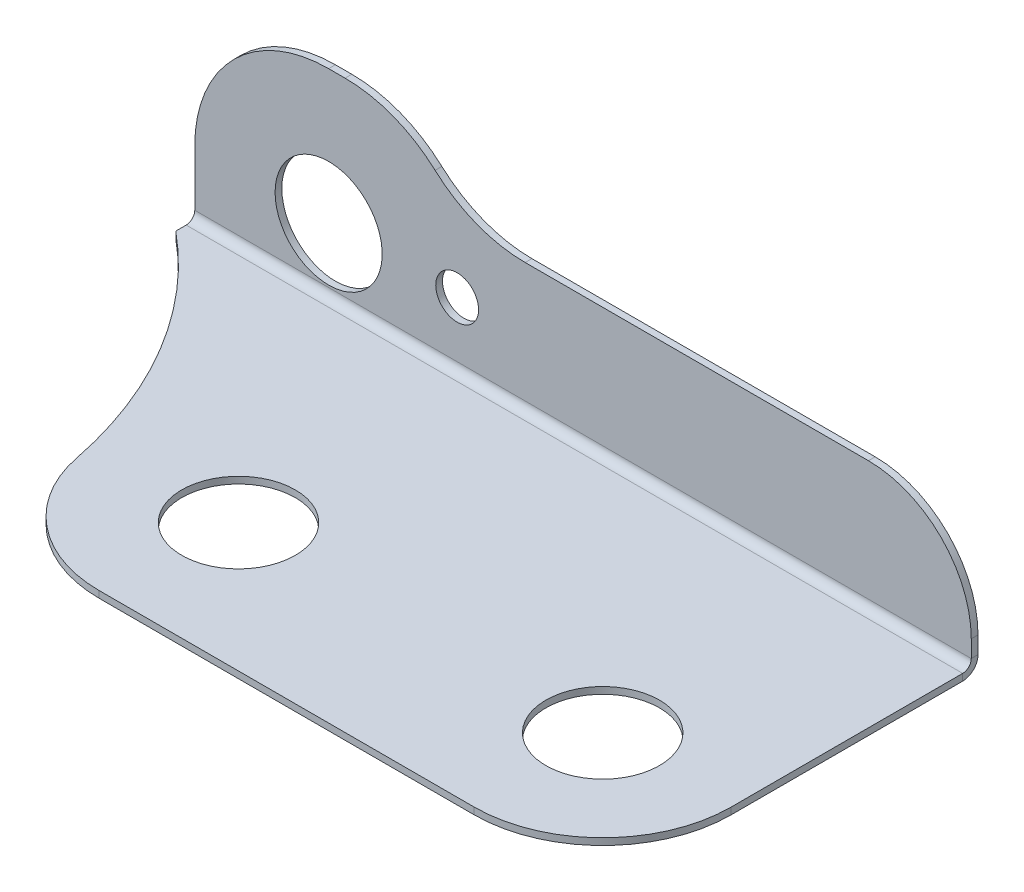
ISO-10303-21;
HEADER;
FILE_DESCRIPTION(('STEP AP214'),'2;1');
FILE_NAME('part.step','',(''),(''),'','','');
FILE_SCHEMA(('AUTOMOTIVE_DESIGN { 1 0 10303 214 1 1 1 1 }'));
ENDSEC;
DATA;
#1=APPLICATION_CONTEXT('core data for automotive mechanical design processes');
#2=APPLICATION_PROTOCOL_DEFINITION('international standard','automotive_design',2000,#1);
#3=PRODUCT_CONTEXT('',#1,'mechanical');
#4=PRODUCT('Part','Part','',(#3));
#5=PRODUCT_RELATED_PRODUCT_CATEGORY('part','',(#4));
#6=PRODUCT_DEFINITION_FORMATION('','',#4);
#7=PRODUCT_DEFINITION_CONTEXT('part definition',#1,'design');
#8=PRODUCT_DEFINITION('design','',#6,#7);
#9=PRODUCT_DEFINITION_SHAPE('','',#8);
#10=(LENGTH_UNIT() NAMED_UNIT(*) SI_UNIT(.MILLI.,.METRE.));
#11=(NAMED_UNIT(*) PLANE_ANGLE_UNIT() SI_UNIT($,.RADIAN.));
#12=(NAMED_UNIT(*) SI_UNIT($,.STERADIAN.) SOLID_ANGLE_UNIT());
#13=UNCERTAINTY_MEASURE_WITH_UNIT(LENGTH_MEASURE(1.E-05),#10,'distance_accuracy_value','');
#14=(GEOMETRIC_REPRESENTATION_CONTEXT(3) GLOBAL_UNCERTAINTY_ASSIGNED_CONTEXT((#13)) GLOBAL_UNIT_ASSIGNED_CONTEXT((#10,
#11,#12)) REPRESENTATION_CONTEXT('',''));
#15=CARTESIAN_POINT('',(0.,0.,0.));
#16=DIRECTION('',(0.,0.,1.));
#17=DIRECTION('',(1.,0.,0.));
#18=AXIS2_PLACEMENT_3D('',#15,#16,#17);
#19=CARTESIAN_POINT('',(-27.6225,-0.39878,-14.6328892));
#20=DIRECTION('',(-1.,0.,0.));
#21=DIRECTION('',(0.,1.,0.));
#22=AXIS2_PLACEMENT_3D('',#19,#20,#21);
#23=PLANE('',#22);
#24=DIRECTION('',(0.,0.,-1.));
#25=VECTOR('',#24,1.);
#26=CARTESIAN_POINT('',(-27.6225,0.50922,-14.6328892));
#27=LINE('',#26,#25);
#28=CARTESIAN_POINT('',(-27.6225,0.50922,-14.2328892));
#29=VERTEX_POINT('',#28);
#30=CARTESIAN_POINT('',(-27.6225,0.50922,-14.6328892));
#31=VERTEX_POINT('',#30);
#32=EDGE_CURVE('E11',#29,#31,#27,.T.);
#33=ORIENTED_EDGE('',*,*,#32,.F.);
#34=DIRECTION('',(0.,1.,0.));
#35=VECTOR('',#34,1.);
#36=CARTESIAN_POINT('',(-27.6225,-0.39878,-14.2328892));
#37=LINE('',#36,#35);
#38=CARTESIAN_POINT('',(-27.6225,3.81,-14.2328892));
#39=VERTEX_POINT('',#38);
#40=EDGE_CURVE('E111',#29,#39,#37,.T.);
#41=ORIENTED_EDGE('',*,*,#40,.T.);
#42=DIRECTION('',(0.,0.,-1.));
#43=VECTOR('',#42,1.);
#44=CARTESIAN_POINT('',(-27.6225,3.81,-14.6328892));
#45=LINE('',#44,#43);
#46=CARTESIAN_POINT('',(-27.6225,3.81,-14.6328892));
#47=VERTEX_POINT('',#46);
#48=EDGE_CURVE('E48',#39,#47,#45,.T.);
#49=ORIENTED_EDGE('',*,*,#48,.T.);
#50=DIRECTION('',(0.,1.,0.));
#51=VECTOR('',#50,1.);
#52=CARTESIAN_POINT('',(-27.6225,-0.39878,-14.6328892));
#53=LINE('',#52,#51);
#54=EDGE_CURVE('E113',#31,#47,#53,.T.);
#55=ORIENTED_EDGE('',*,*,#54,.F.);
#56=EDGE_LOOP('',(#33,#41,#49,#55));
#57=FACE_BOUND('',#56,.T.);
#58=ADVANCED_FACE('F38',(#57),#23,.T.);
#59=CARTESIAN_POINT('',(-19.685,3.81,-14.6328892));
#60=DIRECTION('',(0.,0.,-1.));
#61=DIRECTION('',(-1.,0.,0.));
#62=AXIS2_PLACEMENT_3D('',#59,#60,#61);
#63=CYLINDRICAL_SURFACE('',#62,7.9375);
#64=ORIENTED_EDGE('',*,*,#48,.F.);
#65=CARTESIAN_POINT('',(-19.685,3.81,-14.2328892));
#66=DIRECTION('',(0.,0.,-1.));
#67=DIRECTION('',(-1.,0.,0.));
#68=AXIS2_PLACEMENT_3D('',#65,#66,#67);
#69=CIRCLE('',#68,7.9375);
#70=CARTESIAN_POINT('',(-19.685,11.7475,-14.2328892));
#71=VERTEX_POINT('',#70);
#72=EDGE_CURVE('E138',#39,#71,#69,.T.);
#73=ORIENTED_EDGE('',*,*,#72,.T.);
#74=DIRECTION('',(0.,0.,-1.));
#75=VECTOR('',#74,1.);
#76=CARTESIAN_POINT('',(-19.685,11.7475,-14.6328892));
#77=LINE('',#76,#75);
#78=CARTESIAN_POINT('',(-19.685,11.7475,-14.6328892));
#79=VERTEX_POINT('',#78);
#80=EDGE_CURVE('E189',#71,#79,#77,.T.);
#81=ORIENTED_EDGE('',*,*,#80,.T.);
#82=CARTESIAN_POINT('',(-19.685,3.81,-14.6328892));
#83=DIRECTION('',(0.,0.,-1.));
#84=DIRECTION('',(-1.,0.,0.));
#85=AXIS2_PLACEMENT_3D('',#82,#83,#84);
#86=CIRCLE('',#85,7.9375);
#87=EDGE_CURVE('E203',#47,#79,#86,.T.);
#88=ORIENTED_EDGE('',*,*,#87,.F.);
#89=EDGE_LOOP('',(#64,#73,#81,#88));
#90=FACE_BOUND('',#89,.T.);
#91=ADVANCED_FACE('F209',(#90),#63,.T.);
#92=CARTESIAN_POINT('',(-27.6225,11.7475,-14.6328892));
#93=DIRECTION('',(0.,-1.,0.));
#94=DIRECTION('',(-1.,0.,0.));
#95=AXIS2_PLACEMENT_3D('',#92,#93,#94);
#96=PLANE('',#95);
#97=ORIENTED_EDGE('',*,*,#80,.F.);
#98=DIRECTION('',(-1.,0.,0.));
#99=VECTOR('',#98,1.);
#100=CARTESIAN_POINT('',(18.415,11.7475,-14.2328892));
#101=LINE('',#100,#99);
#102=CARTESIAN_POINT('',(-18.710818623329,11.7475,-14.2328892));
#103=VERTEX_POINT('',#102);
#104=EDGE_CURVE('E153',#103,#71,#101,.T.);
#105=ORIENTED_EDGE('',*,*,#104,.F.);
#106=DIRECTION('',(0.,0.,-1.));
#107=VECTOR('',#106,1.);
#108=CARTESIAN_POINT('',(-18.710818623329,11.7475,-14.6328892));
#109=LINE('',#108,#107);
#110=CARTESIAN_POINT('',(-18.710818623329,11.7475,-14.6328892));
#111=VERTEX_POINT('',#110);
#112=EDGE_CURVE('E186',#103,#111,#109,.T.);
#113=ORIENTED_EDGE('',*,*,#112,.T.);
#114=DIRECTION('',(-1.,0.,0.));
#115=VECTOR('',#114,1.);
#116=CARTESIAN_POINT('',(-27.6225,11.7475,-14.6328892));
#117=LINE('',#116,#115);
#118=EDGE_CURVE('E289',#111,#79,#117,.T.);
#119=ORIENTED_EDGE('',*,*,#118,.T.);
#120=EDGE_LOOP('',(#97,#105,#113,#119));
#121=FACE_BOUND('',#120,.T.);
#122=ADVANCED_FACE('F287',(#121),#96,.F.);
#123=CARTESIAN_POINT('',(-18.710818623329,3.81,-14.6328892));
#124=DIRECTION('',(0.,0.,-1.));
#125=DIRECTION('',(-1.,0.,0.));
#126=AXIS2_PLACEMENT_3D('',#123,#124,#125);
#127=CYLINDRICAL_SURFACE('',#126,7.9375);
#128=ORIENTED_EDGE('',*,*,#112,.F.);
#129=CARTESIAN_POINT('',(-18.710818623329,3.81,-14.2328892));
#130=DIRECTION('',(0.,0.,-1.));
#131=DIRECTION('',(-1.,0.,0.));
#132=AXIS2_PLACEMENT_3D('',#129,#130,#131);
#133=CIRCLE('',#132,7.9375);
#134=CARTESIAN_POINT('',(-13.3720016019749,9.68375,-14.2328892));
#135=VERTEX_POINT('',#134);
#136=EDGE_CURVE('E280',#103,#135,#133,.T.);
#137=ORIENTED_EDGE('',*,*,#136,.T.);
#138=DIRECTION('',(0.,0.,-1.));
#139=VECTOR('',#138,1.);
#140=CARTESIAN_POINT('',(-13.3720016019749,9.68375,-14.6328892));
#141=LINE('',#140,#139);
#142=CARTESIAN_POINT('',(-13.3720016019749,9.68375,-14.6328892));
#143=VERTEX_POINT('',#142);
#144=EDGE_CURVE('E183',#135,#143,#141,.T.);
#145=ORIENTED_EDGE('',*,*,#144,.T.);
#146=CARTESIAN_POINT('',(-18.710818623329,3.81,-14.6328892));
#147=DIRECTION('',(0.,0.,-1.));
#148=DIRECTION('',(-1.,0.,0.));
#149=AXIS2_PLACEMENT_3D('',#146,#147,#148);
#150=CIRCLE('',#149,7.9375);
#151=EDGE_CURVE('E294',#111,#143,#150,.T.);
#152=ORIENTED_EDGE('',*,*,#151,.F.);
#153=EDGE_LOOP('',(#128,#137,#145,#152));
#154=FACE_BOUND('',#153,.T.);
#155=ADVANCED_FACE('F348',(#154),#127,.T.);
#156=CARTESIAN_POINT('',(-8.03318458062082,15.5575,-14.6328892));
#157=DIRECTION('',(0.,0.,-1.));
#158=DIRECTION('',(-1.,0.,0.));
#159=AXIS2_PLACEMENT_3D('',#156,#157,#158);
#160=CYLINDRICAL_SURFACE('',#159,7.9375);
#161=ORIENTED_EDGE('',*,*,#144,.F.);
#162=CARTESIAN_POINT('',(-8.03318458062082,15.5575,-14.2328892));
#163=DIRECTION('',(0.,0.,-1.));
#164=DIRECTION('',(-1.,0.,0.));
#165=AXIS2_PLACEMENT_3D('',#162,#163,#164);
#166=CIRCLE('',#165,7.9375);
#167=CARTESIAN_POINT('',(-8.03318458062081,7.62,-14.2328892));
#168=VERTEX_POINT('',#167);
#169=EDGE_CURVE('E277',#135,#168,#166,.F.);
#170=ORIENTED_EDGE('',*,*,#169,.T.);
#171=DIRECTION('',(0.,0.,-1.));
#172=VECTOR('',#171,1.);
#173=CARTESIAN_POINT('',(-8.03318458062081,7.62,-14.6328892));
#174=LINE('',#173,#172);
#175=CARTESIAN_POINT('',(-8.03318458062081,7.62,-14.6328892));
#176=VERTEX_POINT('',#175);
#177=EDGE_CURVE('E180',#168,#176,#174,.T.);
#178=ORIENTED_EDGE('',*,*,#177,.T.);
#179=CARTESIAN_POINT('',(-8.03318458062082,15.5575,-14.6328892));
#180=DIRECTION('',(0.,0.,-1.));
#181=DIRECTION('',(-1.,0.,0.));
#182=AXIS2_PLACEMENT_3D('',#179,#180,#181);
#183=CIRCLE('',#182,7.9375);
#184=EDGE_CURVE('E297',#143,#176,#183,.F.);
#185=ORIENTED_EDGE('',*,*,#184,.F.);
#186=EDGE_LOOP('',(#161,#170,#178,#185));
#187=FACE_BOUND('',#186,.T.);
#188=ADVANCED_FACE('F351',(#187),#160,.F.);
#189=CARTESIAN_POINT('',(18.415,7.62,-14.6328892));
#190=DIRECTION('',(0.,-1.,0.));
#191=DIRECTION('',(-1.,0.,0.));
#192=AXIS2_PLACEMENT_3D('',#189,#190,#191);
#193=PLANE('',#192);
#194=ORIENTED_EDGE('',*,*,#177,.F.);
#195=DIRECTION('',(-1.,0.,0.));
#196=VECTOR('',#195,1.);
#197=CARTESIAN_POINT('',(18.415,7.62,-14.2328892));
#198=LINE('',#197,#196);
#199=CARTESIAN_POINT('',(12.319,7.62,-14.2328892));
#200=VERTEX_POINT('',#199);
#201=EDGE_CURVE('E274',#200,#168,#198,.T.);
#202=ORIENTED_EDGE('',*,*,#201,.F.);
#203=DIRECTION('',(0.,0.,-1.));
#204=VECTOR('',#203,1.);
#205=CARTESIAN_POINT('',(12.319,7.62,-14.6328892));
#206=LINE('',#205,#204);
#207=CARTESIAN_POINT('',(12.319,7.62,-14.6328892));
#208=VERTEX_POINT('',#207);
#209=EDGE_CURVE('E177',#200,#208,#206,.T.);
#210=ORIENTED_EDGE('',*,*,#209,.T.);
#211=DIRECTION('',(-1.,0.,0.));
#212=VECTOR('',#211,1.);
#213=CARTESIAN_POINT('',(18.415,7.62,-14.6328892));
#214=LINE('',#213,#212);
#215=EDGE_CURVE('E305',#208,#176,#214,.T.);
#216=ORIENTED_EDGE('',*,*,#215,.T.);
#217=EDGE_LOOP('',(#194,#202,#210,#216));
#218=FACE_BOUND('',#217,.T.);
#219=ADVANCED_FACE('F354',(#218),#193,.F.);
#220=CARTESIAN_POINT('',(12.319,1.524,-14.6328892));
#221=DIRECTION('',(0.,0.,-1.));
#222=DIRECTION('',(-1.,0.,0.));
#223=AXIS2_PLACEMENT_3D('',#220,#221,#222);
#224=CYLINDRICAL_SURFACE('',#223,6.096);
#225=ORIENTED_EDGE('',*,*,#209,.F.);
#226=CARTESIAN_POINT('',(12.319,1.524,-14.2328892));
#227=DIRECTION('',(0.,0.,-1.));
#228=DIRECTION('',(-1.,0.,0.));
#229=AXIS2_PLACEMENT_3D('',#226,#227,#228);
#230=CIRCLE('',#229,6.096);
#231=CARTESIAN_POINT('',(18.415,1.524,-14.2328892));
#232=VERTEX_POINT('',#231);
#233=EDGE_CURVE('E271',#200,#232,#230,.T.);
#234=ORIENTED_EDGE('',*,*,#233,.T.);
#235=DIRECTION('',(0.,0.,-1.));
#236=VECTOR('',#235,1.);
#237=CARTESIAN_POINT('',(18.415,1.524,-14.6328892));
#238=LINE('',#237,#236);
#239=CARTESIAN_POINT('',(18.415,1.524,-14.6328892));
#240=VERTEX_POINT('',#239);
#241=EDGE_CURVE('E174',#232,#240,#238,.T.);
#242=ORIENTED_EDGE('',*,*,#241,.T.);
#243=CARTESIAN_POINT('',(12.319,1.524,-14.6328892));
#244=DIRECTION('',(0.,0.,-1.));
#245=DIRECTION('',(-1.,0.,0.));
#246=AXIS2_PLACEMENT_3D('',#243,#244,#245);
#247=CIRCLE('',#246,6.096);
#248=EDGE_CURVE('E308',#208,#240,#247,.T.);
#249=ORIENTED_EDGE('',*,*,#248,.F.);
#250=EDGE_LOOP('',(#225,#234,#242,#249));
#251=FACE_BOUND('',#250,.T.);
#252=ADVANCED_FACE('F357',(#251),#224,.T.);
#253=CARTESIAN_POINT('',(18.415,-0.39878,-14.6328892));
#254=DIRECTION('',(-1.,0.,0.));
#255=DIRECTION('',(0.,1.,0.));
#256=AXIS2_PLACEMENT_3D('',#253,#254,#255);
#257=PLANE('',#256);
#258=ORIENTED_EDGE('',*,*,#241,.F.);
#259=DIRECTION('',(0.,1.,0.));
#260=VECTOR('',#259,1.);
#261=CARTESIAN_POINT('',(18.415,-0.39878,-14.2328892));
#262=LINE('',#261,#260);
#263=CARTESIAN_POINT('',(18.415,0.50922,-14.2328892));
#264=VERTEX_POINT('',#263);
#265=EDGE_CURVE('E139',#264,#232,#262,.T.);
#266=ORIENTED_EDGE('',*,*,#265,.F.);
#267=DIRECTION('',(0.,0.,-1.));
#268=VECTOR('',#267,1.);
#269=CARTESIAN_POINT('',(18.415,0.50922,-14.6328892));
#270=LINE('',#269,#268);
#271=CARTESIAN_POINT('',(18.415,0.50922,-14.6328892));
#272=VERTEX_POINT('',#271);
#273=EDGE_CURVE('E171',#264,#272,#270,.T.);
#274=ORIENTED_EDGE('',*,*,#273,.T.);
#275=DIRECTION('',(0.,1.,0.));
#276=VECTOR('',#275,1.);
#277=CARTESIAN_POINT('',(18.415,-0.39878,-14.6328892));
#278=LINE('',#277,#276);
#279=EDGE_CURVE('E207',#272,#240,#278,.T.);
#280=ORIENTED_EDGE('',*,*,#279,.T.);
#281=EDGE_LOOP('',(#258,#266,#274,#280));
#282=FACE_BOUND('',#281,.T.);
#283=ADVANCED_FACE('F312',(#282),#257,.F.);
#284=CARTESIAN_POINT('',(18.415,0.50922,-13.7248892));
#285=DIRECTION('',(-1.,0.,0.));
#286=DIRECTION('',(0.,0.,1.));
#287=AXIS2_PLACEMENT_3D('',#284,#285,#286);
#288=PLANE('',#287);
#289=ORIENTED_EDGE('',*,*,#273,.F.);
#290=CARTESIAN_POINT('',(18.415,0.50922,-13.7248892));
#291=DIRECTION('',(1.,0.,0.));
#292=DIRECTION('',(0.,0.,-1.));
#293=AXIS2_PLACEMENT_3D('',#290,#291,#292);
#294=CIRCLE('',#293,0.508);
#295=CARTESIAN_POINT('',(18.415,0.00122000000000002,-13.7248892));
#296=VERTEX_POINT('',#295);
#297=EDGE_CURVE('E127',#264,#296,#294,.F.);
#298=ORIENTED_EDGE('',*,*,#297,.T.);
#299=DIRECTION('',(0.,-1.,0.));
#300=VECTOR('',#299,1.);
#301=CARTESIAN_POINT('',(18.415,-0.39878,-13.7248892));
#302=LINE('',#301,#300);
#303=CARTESIAN_POINT('',(18.415,-0.39878,-13.7248892));
#304=VERTEX_POINT('',#303);
#305=EDGE_CURVE('E169',#296,#304,#302,.T.);
#306=ORIENTED_EDGE('',*,*,#305,.T.);
#307=CARTESIAN_POINT('',(18.415,0.50922,-13.7248892));
#308=DIRECTION('',(1.,0.,0.));
#309=DIRECTION('',(0.,0.,-1.));
#310=AXIS2_PLACEMENT_3D('',#307,#308,#309);
#311=CIRCLE('',#310,0.908);
#312=EDGE_CURVE('E242',#272,#304,#311,.F.);
#313=ORIENTED_EDGE('',*,*,#312,.F.);
#314=EDGE_LOOP('',(#289,#298,#306,#313));
#315=FACE_BOUND('',#314,.T.);
#316=ADVANCED_FACE('F322',(#315),#288,.F.);
#317=CARTESIAN_POINT('',(18.415,-0.39878,7.62));
#318=DIRECTION('',(1.,0.,0.));
#319=DIRECTION('',(0.,0.,-1.));
#320=AXIS2_PLACEMENT_3D('',#317,#318,#319);
#321=PLANE('',#320);
#322=ORIENTED_EDGE('',*,*,#305,.F.);
#323=DIRECTION('',(0.,0.,1.));
#324=VECTOR('',#323,1.);
#325=CARTESIAN_POINT('',(18.415,0.00122000000000007,0.));
#326=LINE('',#325,#324);
#327=CARTESIAN_POINT('',(18.415,0.00122000000000007,0.));
#328=VERTEX_POINT('',#327);
#329=EDGE_CURVE('E253',#328,#296,#326,.F.);
#330=ORIENTED_EDGE('',*,*,#329,.F.);
#331=DIRECTION('',(0.,-1.,0.));
#332=VECTOR('',#331,1.);
#333=CARTESIAN_POINT('',(18.415,-0.39878,0.));
#334=LINE('',#333,#332);
#335=CARTESIAN_POINT('',(18.415,-0.39878,0.));
#336=VERTEX_POINT('',#335);
#337=EDGE_CURVE('E166',#328,#336,#334,.T.);
#338=ORIENTED_EDGE('',*,*,#337,.T.);
#339=DIRECTION('',(0.,0.,-1.));
#340=VECTOR('',#339,1.);
#341=CARTESIAN_POINT('',(18.415,-0.39878,7.62));
#342=LINE('',#341,#340);
#343=EDGE_CURVE('E219',#336,#304,#342,.T.);
#344=ORIENTED_EDGE('',*,*,#343,.T.);
#345=EDGE_LOOP('',(#322,#330,#338,#344));
#346=FACE_BOUND('',#345,.T.);
#347=ADVANCED_FACE('F426',(#346),#321,.T.);
#348=CARTESIAN_POINT('',(10.795,-0.39878,0.));
#349=DIRECTION('',(0.,1.,0.));
#350=DIRECTION('',(0.,0.,1.));
#351=AXIS2_PLACEMENT_3D('',#348,#349,#350);
#352=CYLINDRICAL_SURFACE('',#351,7.62);
#353=ORIENTED_EDGE('',*,*,#337,.F.);
#354=CARTESIAN_POINT('',(10.795,0.00122000000000007,0.));
#355=DIRECTION('',(0.,1.,0.));
#356=DIRECTION('',(0.,0.,1.));
#357=AXIS2_PLACEMENT_3D('',#354,#355,#356);
#358=CIRCLE('',#357,7.62);
#359=CARTESIAN_POINT('',(10.795,0.00122000000000007,7.62));
#360=VERTEX_POINT('',#359);
#361=EDGE_CURVE('E265',#328,#360,#358,.F.);
#362=ORIENTED_EDGE('',*,*,#361,.T.);
#363=DIRECTION('',(0.,-1.,0.));
#364=VECTOR('',#363,1.);
#365=CARTESIAN_POINT('',(10.795,-0.39878,7.62));
#366=LINE('',#365,#364);
#367=CARTESIAN_POINT('',(10.795,-0.39878,7.62));
#368=VERTEX_POINT('',#367);
#369=EDGE_CURVE('E163',#360,#368,#366,.T.);
#370=ORIENTED_EDGE('',*,*,#369,.T.);
#371=CARTESIAN_POINT('',(10.795,-0.39878,0.));
#372=DIRECTION('',(0.,1.,0.));
#373=DIRECTION('',(0.,0.,1.));
#374=AXIS2_PLACEMENT_3D('',#371,#372,#373);
#375=CIRCLE('',#374,7.62);
#376=EDGE_CURVE('E222',#336,#368,#375,.F.);
#377=ORIENTED_EDGE('',*,*,#376,.F.);
#378=EDGE_LOOP('',(#353,#362,#370,#377));
#379=FACE_BOUND('',#378,.T.);
#380=ADVANCED_FACE('F422',(#379),#352,.T.);
#381=CARTESIAN_POINT('',(-18.415,-0.39878,7.62));
#382=DIRECTION('',(0.,0.,1.));
#383=DIRECTION('',(1.,0.,0.));
#384=AXIS2_PLACEMENT_3D('',#381,#382,#383);
#385=PLANE('',#384);
#386=ORIENTED_EDGE('',*,*,#369,.F.);
#387=DIRECTION('',(1.,0.,0.));
#388=VECTOR('',#387,1.);
#389=CARTESIAN_POINT('',(0.,0.00122000000000007,7.62));
#390=LINE('',#389,#388);
#391=CARTESIAN_POINT('',(-11.4331888097694,0.00122000000000007,7.62));
#392=VERTEX_POINT('',#391);
#393=EDGE_CURVE('E262',#392,#360,#390,.T.);
#394=ORIENTED_EDGE('',*,*,#393,.F.);
#395=DIRECTION('',(0.,-1.,0.));
#396=VECTOR('',#395,1.);
#397=CARTESIAN_POINT('',(-11.4331888097694,-0.39878,7.62));
#398=LINE('',#397,#396);
#399=CARTESIAN_POINT('',(-11.4331888097694,-0.39878,7.62));
#400=VERTEX_POINT('',#399);
#401=EDGE_CURVE('E160',#392,#400,#398,.T.);
#402=ORIENTED_EDGE('',*,*,#401,.T.);
#403=DIRECTION('',(1.,0.,0.));
#404=VECTOR('',#403,1.);
#405=CARTESIAN_POINT('',(-18.415,-0.39878,7.62));
#406=LINE('',#405,#404);
#407=EDGE_CURVE('E225',#400,#368,#406,.T.);
#408=ORIENTED_EDGE('',*,*,#407,.T.);
#409=EDGE_LOOP('',(#386,#394,#402,#408));
#410=FACE_BOUND('',#409,.T.);
#411=ADVANCED_FACE('F418',(#410),#385,.T.);
#412=CARTESIAN_POINT('',(-11.4331888097694,-0.39878,0.));
#413=DIRECTION('',(0.,1.,0.));
#414=DIRECTION('',(0.,0.,1.));
#415=AXIS2_PLACEMENT_3D('',#412,#413,#414);
#416=CYLINDRICAL_SURFACE('',#415,7.62);
#417=ORIENTED_EDGE('',*,*,#401,.F.);
#418=CARTESIAN_POINT('',(-11.4331888097694,0.00122000000000007,0.));
#419=DIRECTION('',(0.,1.,0.));
#420=DIRECTION('',(0.,0.,1.));
#421=AXIS2_PLACEMENT_3D('',#418,#419,#420);
#422=CIRCLE('',#421,7.62);
#423=CARTESIAN_POINT('',(-18.9059144690533,0.00122000000000007,1.49089611344271));
#424=VERTEX_POINT('',#423);
#425=EDGE_CURVE('E259',#392,#424,#422,.F.);
#426=ORIENTED_EDGE('',*,*,#425,.T.);
#427=DIRECTION('',(0.,-1.,0.));
#428=VECTOR('',#427,1.);
#429=CARTESIAN_POINT('',(-18.9059144690533,-0.39878,1.49089611344271));
#430=LINE('',#429,#428);
#431=CARTESIAN_POINT('',(-18.9059144690533,-0.39878,1.49089611344271));
#432=VERTEX_POINT('',#431);
#433=EDGE_CURVE('E157',#424,#432,#430,.T.);
#434=ORIENTED_EDGE('',*,*,#433,.T.);
#435=CARTESIAN_POINT('',(-11.4331888097694,-0.39878,0.));
#436=DIRECTION('',(0.,1.,0.));
#437=DIRECTION('',(0.,0.,1.));
#438=AXIS2_PLACEMENT_3D('',#435,#436,#437);
#439=CIRCLE('',#438,7.62);
#440=EDGE_CURVE('E228',#400,#432,#439,.F.);
#441=ORIENTED_EDGE('',*,*,#440,.F.);
#442=EDGE_LOOP('',(#417,#426,#434,#441));
#443=FACE_BOUND('',#442,.T.);
#444=ADVANCED_FACE('F415',(#443),#416,.T.);
#445=CARTESIAN_POINT('',(-43.815,-0.39878,6.46054982491842));
#446=DIRECTION('',(0.,1.,0.));
#447=DIRECTION('',(0.,0.,1.));
#448=AXIS2_PLACEMENT_3D('',#445,#446,#447);
#449=CYLINDRICAL_SURFACE('',#448,25.4);
#450=ORIENTED_EDGE('',*,*,#433,.F.);
#451=CARTESIAN_POINT('',(-43.815,0.00122000000000007,6.46054982491842));
#452=DIRECTION('',(0.,1.,0.));
#453=DIRECTION('',(0.,0.,1.));
#454=AXIS2_PLACEMENT_3D('',#451,#452,#453);
#455=CIRCLE('',#454,25.4);
#456=CARTESIAN_POINT('',(-27.6225,0.00122000000000007,-13.1088892));
#457=VERTEX_POINT('',#456);
#458=EDGE_CURVE('E256',#424,#457,#455,.T.);
#459=ORIENTED_EDGE('',*,*,#458,.T.);
#460=DIRECTION('',(0.,-1.,0.));
#461=VECTOR('',#460,1.);
#462=CARTESIAN_POINT('',(-27.6225,-0.39878,-13.1088892));
#463=LINE('',#462,#461);
#464=CARTESIAN_POINT('',(-27.6225,-0.39878,-13.1088892));
#465=VERTEX_POINT('',#464);
#466=EDGE_CURVE('E154',#457,#465,#463,.T.);
#467=ORIENTED_EDGE('',*,*,#466,.T.);
#468=CARTESIAN_POINT('',(-43.815,-0.39878,6.46054982491842));
#469=DIRECTION('',(0.,1.,0.));
#470=DIRECTION('',(0.,0.,1.));
#471=AXIS2_PLACEMENT_3D('',#468,#469,#470);
#472=CIRCLE('',#471,25.4);
#473=EDGE_CURVE('E231',#432,#465,#472,.T.);
#474=ORIENTED_EDGE('',*,*,#473,.F.);
#475=EDGE_LOOP('',(#450,#459,#467,#474));
#476=FACE_BOUND('',#475,.T.);
#477=ADVANCED_FACE('F385',(#476),#449,.F.);
#478=CARTESIAN_POINT('',(-27.6225,-0.39878,-14.6328892));
#479=DIRECTION('',(-1.,0.,0.));
#480=DIRECTION('',(0.,0.,1.));
#481=AXIS2_PLACEMENT_3D('',#478,#479,#480);
#482=PLANE('',#481);
#483=ORIENTED_EDGE('',*,*,#466,.F.);
#484=DIRECTION('',(0.,0.,1.));
#485=VECTOR('',#484,1.);
#486=CARTESIAN_POINT('',(-27.6225,0.00122000000000007,0.));
#487=LINE('',#486,#485);
#488=CARTESIAN_POINT('',(-27.6225,0.00122000000000007,-13.7248892));
#489=VERTEX_POINT('',#488);
#490=EDGE_CURVE('E132',#489,#457,#487,.T.);
#491=ORIENTED_EDGE('',*,*,#490,.F.);
#492=DIRECTION('',(0.,-1.,0.));
#493=VECTOR('',#492,1.);
#494=CARTESIAN_POINT('',(-27.6225,-0.39878,-13.7248892));
#495=LINE('',#494,#493);
#496=CARTESIAN_POINT('',(-27.6225,-0.39878,-13.7248892));
#497=VERTEX_POINT('',#496);
#498=EDGE_CURVE('E42',#489,#497,#495,.T.);
#499=ORIENTED_EDGE('',*,*,#498,.T.);
#500=DIRECTION('',(0.,0.,1.));
#501=VECTOR('',#500,1.);
#502=CARTESIAN_POINT('',(-27.6225,-0.39878,-14.6328892));
#503=LINE('',#502,#501);
#504=EDGE_CURVE('E234',#497,#465,#503,.T.);
#505=ORIENTED_EDGE('',*,*,#504,.T.);
#506=EDGE_LOOP('',(#483,#491,#499,#505));
#507=FACE_BOUND('',#506,.T.);
#508=ADVANCED_FACE('F331',(#507),#482,.T.);
#509=CARTESIAN_POINT('',(-19.685,3.81,-14.6328892));
#510=DIRECTION('',(0.,0.,-1.));
#511=DIRECTION('',(-1.,0.,0.));
#512=AXIS2_PLACEMENT_3D('',#509,#510,#511);
#513=CYLINDRICAL_SURFACE('',#512,3.175);
#514=CARTESIAN_POINT('',(-19.685,3.81,-14.6328892));
#515=DIRECTION('',(0.,0.,-1.));
#516=DIRECTION('',(-1.,0.,0.));
#517=AXIS2_PLACEMENT_3D('',#514,#515,#516);
#518=CIRCLE('',#517,3.175);
#519=CARTESIAN_POINT('',(-22.86,3.81,-14.6328892));
#520=VERTEX_POINT('',#519);
#521=EDGE_CURVE('E245',#520,#520,#518,.T.);
#522=ORIENTED_EDGE('',*,*,#521,.T.);
#523=EDGE_LOOP('',(#522));
#524=FACE_BOUND('',#523,.T.);
#525=CARTESIAN_POINT('',(-19.685,3.81,-14.2328892));
#526=DIRECTION('',(0.,0.,-1.));
#527=DIRECTION('',(-1.,0.,0.));
#528=AXIS2_PLACEMENT_3D('',#525,#526,#527);
#529=CIRCLE('',#528,3.175);
#530=CARTESIAN_POINT('',(-22.86,3.81,-14.2328892));
#531=VERTEX_POINT('',#530);
#532=EDGE_CURVE('E144',#531,#531,#529,.T.);
#533=ORIENTED_EDGE('',*,*,#532,.F.);
#534=EDGE_LOOP('',(#533));
#535=FACE_BOUND('',#534,.T.);
#536=ADVANCED_FACE('F376',(#524,#535),#513,.F.);
#537=CARTESIAN_POINT('',(-12.065,3.81,-14.6328892));
#538=DIRECTION('',(0.,0.,-1.));
#539=DIRECTION('',(-1.,0.,0.));
#540=AXIS2_PLACEMENT_3D('',#537,#538,#539);
#541=CYLINDRICAL_SURFACE('',#540,1.27);
#542=CARTESIAN_POINT('',(-12.065,3.81,-14.6328892));
#543=DIRECTION('',(0.,0.,-1.));
#544=DIRECTION('',(-1.,0.,0.));
#545=AXIS2_PLACEMENT_3D('',#542,#543,#544);
#546=CIRCLE('',#545,1.27);
#547=CARTESIAN_POINT('',(-13.335,3.81,-14.6328892));
#548=VERTEX_POINT('',#547);
#549=EDGE_CURVE('E295',#548,#548,#546,.T.);
#550=ORIENTED_EDGE('',*,*,#549,.T.);
#551=EDGE_LOOP('',(#550));
#552=FACE_BOUND('',#551,.T.);
#553=CARTESIAN_POINT('',(-12.065,3.81,-14.2328892));
#554=DIRECTION('',(0.,0.,-1.));
#555=DIRECTION('',(-1.,0.,0.));
#556=AXIS2_PLACEMENT_3D('',#553,#554,#555);
#557=CIRCLE('',#556,1.27);
#558=CARTESIAN_POINT('',(-13.335,3.81,-14.2328892));
#559=VERTEX_POINT('',#558);
#560=EDGE_CURVE('E150',#559,#559,#557,.T.);
#561=ORIENTED_EDGE('',*,*,#560,.F.);
#562=EDGE_LOOP('',(#561));
#563=FACE_BOUND('',#562,.T.);
#564=ADVANCED_FACE('F40',(#552,#563),#541,.F.);
#565=CARTESIAN_POINT('',(10.795,-0.39878,0.));
#566=DIRECTION('',(0.,1.,0.));
#567=DIRECTION('',(0.,0.,1.));
#568=AXIS2_PLACEMENT_3D('',#565,#566,#567);
#569=CYLINDRICAL_SURFACE('',#568,3.3655);
#570=CARTESIAN_POINT('',(10.795,-0.39878,0.));
#571=DIRECTION('',(0.,-1.,0.));
#572=DIRECTION('',(0.,0.,-1.));
#573=AXIS2_PLACEMENT_3D('',#570,#571,#572);
#574=CIRCLE('',#573,3.3655);
#575=CARTESIAN_POINT('',(10.795,-0.39878,-3.3655));
#576=VERTEX_POINT('',#575);
#577=EDGE_CURVE('E210',#576,#576,#574,.T.);
#578=ORIENTED_EDGE('',*,*,#577,.T.);
#579=EDGE_LOOP('',(#578));
#580=FACE_BOUND('',#579,.T.);
#581=CARTESIAN_POINT('',(10.795,0.00122000000000007,0.));
#582=DIRECTION('',(0.,-1.,0.));
#583=DIRECTION('',(0.,0.,-1.));
#584=AXIS2_PLACEMENT_3D('',#581,#582,#583);
#585=CIRCLE('',#584,3.3655);
#586=CARTESIAN_POINT('',(10.795,0.00122000000000007,-3.3655));
#587=VERTEX_POINT('',#586);
#588=EDGE_CURVE('E247',#587,#587,#585,.T.);
#589=ORIENTED_EDGE('',*,*,#588,.F.);
#590=EDGE_LOOP('',(#589));
#591=FACE_BOUND('',#590,.T.);
#592=ADVANCED_FACE('F383',(#580,#591),#569,.F.);
#593=CARTESIAN_POINT('',(-10.795,-0.39878,0.));
#594=DIRECTION('',(0.,1.,0.));
#595=DIRECTION('',(0.,0.,1.));
#596=AXIS2_PLACEMENT_3D('',#593,#594,#595);
#597=CYLINDRICAL_SURFACE('',#596,3.3655);
#598=CARTESIAN_POINT('',(-10.795,-0.39878,0.));
#599=DIRECTION('',(0.,-1.,0.));
#600=DIRECTION('',(0.,0.,-1.));
#601=AXIS2_PLACEMENT_3D('',#598,#599,#600);
#602=CIRCLE('',#601,3.3655);
#603=CARTESIAN_POINT('',(-10.795,-0.39878,-3.3655));
#604=VERTEX_POINT('',#603);
#605=EDGE_CURVE('E213',#604,#604,#602,.T.);
#606=ORIENTED_EDGE('',*,*,#605,.T.);
#607=EDGE_LOOP('',(#606));
#608=FACE_BOUND('',#607,.T.);
#609=CARTESIAN_POINT('',(-10.795,0.00122000000000007,0.));
#610=DIRECTION('',(0.,-1.,0.));
#611=DIRECTION('',(0.,0.,-1.));
#612=AXIS2_PLACEMENT_3D('',#609,#610,#611);
#613=CIRCLE('',#612,3.3655);
#614=CARTESIAN_POINT('',(-10.795,0.00122000000000007,-3.3655));
#615=VERTEX_POINT('',#614);
#616=EDGE_CURVE('E250',#615,#615,#613,.T.);
#617=ORIENTED_EDGE('',*,*,#616,.F.);
#618=EDGE_LOOP('',(#617));
#619=FACE_BOUND('',#618,.T.);
#620=ADVANCED_FACE('F375',(#608,#619),#597,.F.);
#621=CARTESIAN_POINT('',(-27.6225,0.50922,-13.7248892));
#622=DIRECTION('',(-1.,0.,0.));
#623=DIRECTION('',(0.,0.,1.));
#624=AXIS2_PLACEMENT_3D('',#621,#622,#623);
#625=PLANE('',#624);
#626=CARTESIAN_POINT('',(-27.6225,0.50922,-13.7248892));
#627=DIRECTION('',(1.,0.,0.));
#628=DIRECTION('',(0.,0.,-1.));
#629=AXIS2_PLACEMENT_3D('',#626,#627,#628);
#630=CIRCLE('',#629,0.508);
#631=EDGE_CURVE('E125',#489,#29,#630,.T.);
#632=ORIENTED_EDGE('',*,*,#631,.T.);
#633=ORIENTED_EDGE('',*,*,#32,.T.);
#634=CARTESIAN_POINT('',(-27.6225,0.50922,-13.7248892));
#635=DIRECTION('',(1.,0.,0.));
#636=DIRECTION('',(0.,0.,-1.));
#637=AXIS2_PLACEMENT_3D('',#634,#635,#636);
#638=CIRCLE('',#637,0.908);
#639=EDGE_CURVE('E240',#497,#31,#638,.T.);
#640=ORIENTED_EDGE('',*,*,#639,.F.);
#641=ORIENTED_EDGE('',*,*,#498,.F.);
#642=EDGE_LOOP('',(#632,#633,#640,#641));
#643=FACE_BOUND('',#642,.T.);
#644=ADVANCED_FACE('F141',(#643),#625,.T.);
#645=CARTESIAN_POINT('',(0.,-0.39878,0.));
#646=DIRECTION('',(0.,1.,0.));
#647=DIRECTION('',(0.,0.,1.));
#648=AXIS2_PLACEMENT_3D('',#645,#646,#647);
#649=PLANE('',#648);
#650=ORIENTED_EDGE('',*,*,#577,.F.);
#651=EDGE_LOOP('',(#650));
#652=FACE_BOUND('',#651,.T.);
#653=ORIENTED_EDGE('',*,*,#605,.F.);
#654=EDGE_LOOP('',(#653));
#655=FACE_BOUND('',#654,.T.);
#656=ORIENTED_EDGE('',*,*,#504,.F.);
#657=DIRECTION('',(-1.,0.,0.));
#658=VECTOR('',#657,1.);
#659=CARTESIAN_POINT('',(18.415,-0.39878,-13.7248892));
#660=LINE('',#659,#658);
#661=EDGE_CURVE('E237',#497,#304,#660,.F.);
#662=ORIENTED_EDGE('',*,*,#661,.T.);
#663=ORIENTED_EDGE('',*,*,#343,.F.);
#664=ORIENTED_EDGE('',*,*,#376,.T.);
#665=ORIENTED_EDGE('',*,*,#407,.F.);
#666=ORIENTED_EDGE('',*,*,#440,.T.);
#667=ORIENTED_EDGE('',*,*,#473,.T.);
#668=EDGE_LOOP('',(#656,#662,#663,#664,#665,#666,#667));
#669=FACE_BOUND('',#668,.T.);
#670=ADVANCED_FACE('F328',(#652,#655,#669),#649,.F.);
#671=CARTESIAN_POINT('',(18.415,-0.39878,-14.6328892));
#672=DIRECTION('',(0.,0.,-1.));
#673=DIRECTION('',(-1.,0.,0.));
#674=AXIS2_PLACEMENT_3D('',#671,#672,#673);
#675=PLANE('',#674);
#676=ORIENTED_EDGE('',*,*,#521,.F.);
#677=EDGE_LOOP('',(#676));
#678=FACE_BOUND('',#677,.T.);
#679=ORIENTED_EDGE('',*,*,#549,.F.);
#680=EDGE_LOOP('',(#679));
#681=FACE_BOUND('',#680,.T.);
#682=ORIENTED_EDGE('',*,*,#279,.F.);
#683=DIRECTION('',(-1.,0.,0.));
#684=VECTOR('',#683,1.);
#685=CARTESIAN_POINT('',(-27.6225,0.50922,-14.6328892));
#686=LINE('',#685,#684);
#687=EDGE_CURVE('E206',#272,#31,#686,.T.);
#688=ORIENTED_EDGE('',*,*,#687,.T.);
#689=ORIENTED_EDGE('',*,*,#54,.T.);
#690=ORIENTED_EDGE('',*,*,#87,.T.);
#691=ORIENTED_EDGE('',*,*,#118,.F.);
#692=ORIENTED_EDGE('',*,*,#151,.T.);
#693=ORIENTED_EDGE('',*,*,#184,.T.);
#694=ORIENTED_EDGE('',*,*,#215,.F.);
#695=ORIENTED_EDGE('',*,*,#248,.T.);
#696=EDGE_LOOP('',(#682,#688,#689,#690,#691,#692,#693,#694,#695));
#697=FACE_BOUND('',#696,.T.);
#698=ADVANCED_FACE('F201',(#678,#681,#697),#675,.T.);
#699=CARTESIAN_POINT('',(18.415,0.50922,-13.7248892));
#700=DIRECTION('',(1.,0.,0.));
#701=DIRECTION('',(0.,0.,-1.));
#702=AXIS2_PLACEMENT_3D('',#699,#700,#701);
#703=CYLINDRICAL_SURFACE('',#702,0.908);
#704=ORIENTED_EDGE('',*,*,#312,.T.);
#705=ORIENTED_EDGE('',*,*,#661,.F.);
#706=ORIENTED_EDGE('',*,*,#639,.T.);
#707=ORIENTED_EDGE('',*,*,#687,.F.);
#708=EDGE_LOOP('',(#704,#705,#706,#707));
#709=FACE_BOUND('',#708,.T.);
#710=ADVANCED_FACE('F325',(#709),#703,.T.);
#711=CARTESIAN_POINT('',(0.,0.00122000000000007,0.));
#712=DIRECTION('',(0.,1.,0.));
#713=DIRECTION('',(0.,0.,1.));
#714=AXIS2_PLACEMENT_3D('',#711,#712,#713);
#715=PLANE('',#714);
#716=ORIENTED_EDGE('',*,*,#588,.T.);
#717=EDGE_LOOP('',(#716));
#718=FACE_BOUND('',#717,.T.);
#719=ORIENTED_EDGE('',*,*,#616,.T.);
#720=EDGE_LOOP('',(#719));
#721=FACE_BOUND('',#720,.T.);
#722=ORIENTED_EDGE('',*,*,#490,.T.);
#723=ORIENTED_EDGE('',*,*,#458,.F.);
#724=ORIENTED_EDGE('',*,*,#425,.F.);
#725=ORIENTED_EDGE('',*,*,#393,.T.);
#726=ORIENTED_EDGE('',*,*,#361,.F.);
#727=ORIENTED_EDGE('',*,*,#329,.T.);
#728=DIRECTION('',(1.,0.,0.));
#729=VECTOR('',#728,1.);
#730=CARTESIAN_POINT('',(0.,0.00122000000000007,-13.7248892));
#731=LINE('',#730,#729);
#732=EDGE_CURVE('E131',#489,#296,#731,.T.);
#733=ORIENTED_EDGE('',*,*,#732,.F.);
#734=EDGE_LOOP('',(#722,#723,#724,#725,#726,#727,#733));
#735=FACE_BOUND('',#734,.T.);
#736=ADVANCED_FACE('F394',(#718,#721,#735),#715,.T.);
#737=CARTESIAN_POINT('',(18.415,-0.39878,-14.2328892));
#738=DIRECTION('',(0.,0.,-1.));
#739=DIRECTION('',(-1.,0.,0.));
#740=AXIS2_PLACEMENT_3D('',#737,#738,#739);
#741=PLANE('',#740);
#742=ORIENTED_EDGE('',*,*,#532,.T.);
#743=EDGE_LOOP('',(#742));
#744=FACE_BOUND('',#743,.T.);
#745=ORIENTED_EDGE('',*,*,#560,.T.);
#746=EDGE_LOOP('',(#745));
#747=FACE_BOUND('',#746,.T.);
#748=ORIENTED_EDGE('',*,*,#265,.T.);
#749=ORIENTED_EDGE('',*,*,#233,.F.);
#750=ORIENTED_EDGE('',*,*,#201,.T.);
#751=ORIENTED_EDGE('',*,*,#169,.F.);
#752=ORIENTED_EDGE('',*,*,#136,.F.);
#753=ORIENTED_EDGE('',*,*,#104,.T.);
#754=ORIENTED_EDGE('',*,*,#72,.F.);
#755=ORIENTED_EDGE('',*,*,#40,.F.);
#756=DIRECTION('',(-1.,0.,0.));
#757=VECTOR('',#756,1.);
#758=CARTESIAN_POINT('',(18.415,0.50922,-14.2328892));
#759=LINE('',#758,#757);
#760=EDGE_CURVE('E122',#264,#29,#759,.T.);
#761=ORIENTED_EDGE('',*,*,#760,.F.);
#762=EDGE_LOOP('',(#748,#749,#750,#751,#752,#753,#754,#755,#761));
#763=FACE_BOUND('',#762,.T.);
#764=ADVANCED_FACE('F135',(#744,#747,#763),#741,.F.);
#765=CARTESIAN_POINT('',(18.415,0.50922,-13.7248892));
#766=DIRECTION('',(1.,0.,0.));
#767=DIRECTION('',(0.,0.,-1.));
#768=AXIS2_PLACEMENT_3D('',#765,#766,#767);
#769=CYLINDRICAL_SURFACE('',#768,0.508);
#770=ORIENTED_EDGE('',*,*,#297,.F.);
#771=ORIENTED_EDGE('',*,*,#760,.T.);
#772=ORIENTED_EDGE('',*,*,#631,.F.);
#773=ORIENTED_EDGE('',*,*,#732,.T.);
#774=EDGE_LOOP('',(#770,#771,#772,#773));
#775=FACE_BOUND('',#774,.T.);
#776=ADVANCED_FACE('F123',(#775),#769,.F.);
#777=CLOSED_SHELL('',(#58,#91,#122,#155,#188,#219,#252,#283,#316,#347,#380,#411,#444,#477,#508,
#536,#564,#592,#620,#644,#670,#698,#710,#736,#764,#776));
#778=MANIFOLD_SOLID_BREP('B2',#777);
#779=ADVANCED_BREP_SHAPE_REPRESENTATION('',(#18,#778),#14);
#780=SHAPE_DEFINITION_REPRESENTATION(#9,#779);
ENDSEC;
END-ISO-10303-21;
